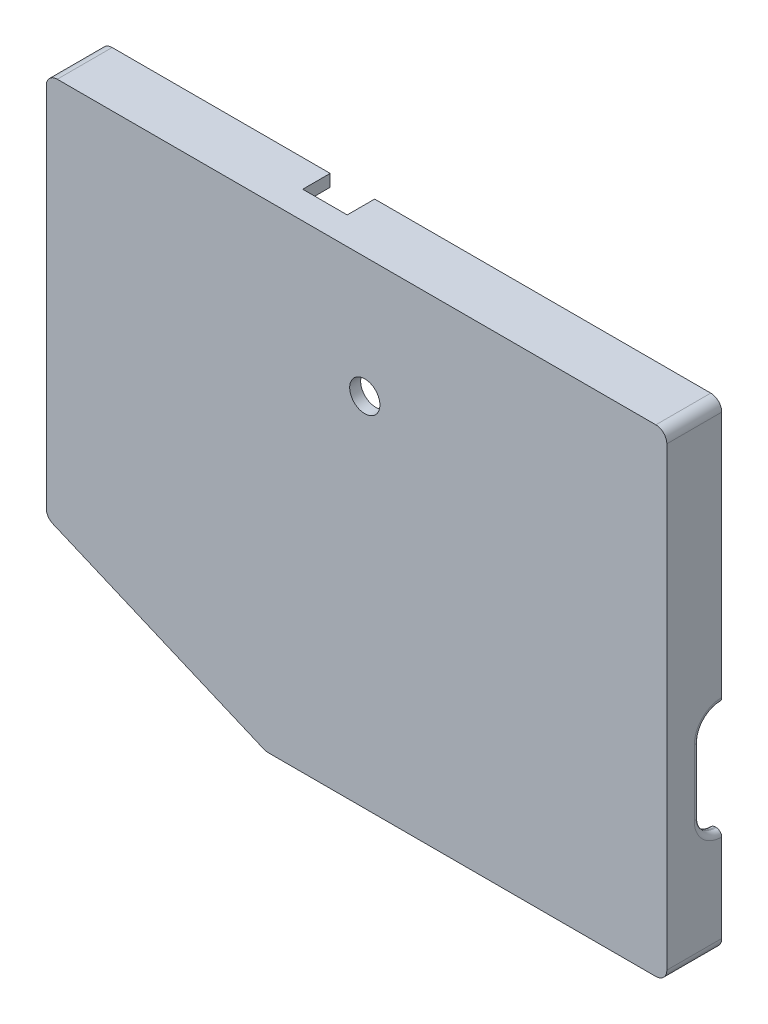
ISO-10303-21;
HEADER;
FILE_DESCRIPTION(('STEP AP214'),'2;1');
FILE_NAME('part.step','',(''),(''),'','','');
FILE_SCHEMA(('AUTOMOTIVE_DESIGN { 1 0 10303 214 1 1 1 1 }'));
ENDSEC;
DATA;
#1=APPLICATION_CONTEXT('core data for automotive mechanical design processes');
#2=APPLICATION_PROTOCOL_DEFINITION('international standard','automotive_design',2000,#1);
#3=PRODUCT_CONTEXT('',#1,'mechanical');
#4=PRODUCT('Part','Part','',(#3));
#5=PRODUCT_RELATED_PRODUCT_CATEGORY('part','',(#4));
#6=PRODUCT_DEFINITION_FORMATION('','',#4);
#7=PRODUCT_DEFINITION_CONTEXT('part definition',#1,'design');
#8=PRODUCT_DEFINITION('design','',#6,#7);
#9=PRODUCT_DEFINITION_SHAPE('','',#8);
#10=(LENGTH_UNIT() NAMED_UNIT(*) SI_UNIT(.MILLI.,.METRE.));
#11=(NAMED_UNIT(*) PLANE_ANGLE_UNIT() SI_UNIT($,.RADIAN.));
#12=(NAMED_UNIT(*) SI_UNIT($,.STERADIAN.) SOLID_ANGLE_UNIT());
#13=UNCERTAINTY_MEASURE_WITH_UNIT(LENGTH_MEASURE(1.E-05),#10,'distance_accuracy_value','');
#14=(GEOMETRIC_REPRESENTATION_CONTEXT(3) GLOBAL_UNCERTAINTY_ASSIGNED_CONTEXT((#13)) GLOBAL_UNIT_ASSIGNED_CONTEXT((#10,
#11,#12)) REPRESENTATION_CONTEXT('',''));
#15=CARTESIAN_POINT('',(0.,0.,0.));
#16=DIRECTION('',(0.,0.,1.));
#17=DIRECTION('',(1.,0.,0.));
#18=AXIS2_PLACEMENT_3D('',#15,#16,#17);
#19=CARTESIAN_POINT('',(16.5,43.5,0.));
#20=DIRECTION('',(0.,0.,1.));
#21=DIRECTION('',(1.,0.,0.));
#22=AXIS2_PLACEMENT_3D('',#19,#20,#21);
#23=PLANE('',#22);
#24=CARTESIAN_POINT('',(18.,65.,0.));
#25=DIRECTION('',(0.,0.,1.));
#26=DIRECTION('',(-1.,0.,0.));
#27=AXIS2_PLACEMENT_3D('',#24,#25,#26);
#28=CIRCLE('',#27,2.75);
#29=CARTESIAN_POINT('',(20.75,65.,0.));
#30=VERTEX_POINT('',#29);
#31=EDGE_CURVE('E330',#30,#30,#28,.T.);
#32=ORIENTED_EDGE('',*,*,#31,.T.);
#33=EDGE_LOOP('',(#32));
#34=FACE_BOUND('',#33,.T.);
#35=DIRECTION('',(0.,1.,0.));
#36=VECTOR('',#35,1.);
#37=CARTESIAN_POINT('',(-37.8,64.15,0.));
#38=LINE('',#37,#36);
#39=CARTESIAN_POINT('',(-37.8,18.4554445193311,0.));
#40=VERTEX_POINT('',#39);
#41=CARTESIAN_POINT('',(-37.8,84.8,0.));
#42=VERTEX_POINT('',#41);
#43=EDGE_CURVE('E312',#40,#42,#38,.T.);
#44=ORIENTED_EDGE('',*,*,#43,.T.);
#45=DIRECTION('',(1.,0.,0.));
#46=VECTOR('',#45,1.);
#47=CARTESIAN_POINT('',(43.65,84.8,0.));
#48=LINE('',#47,#46);
#49=CARTESIAN_POINT('',(70.8,84.8,0.));
#50=VERTEX_POINT('',#49);
#51=EDGE_CURVE('E411',#42,#50,#48,.T.);
#52=ORIENTED_EDGE('',*,*,#51,.T.);
#53=DIRECTION('',(0.,-1.,0.));
#54=VECTOR('',#53,1.);
#55=CARTESIAN_POINT('',(70.8,22.85,0.));
#56=LINE('',#55,#54);
#57=CARTESIAN_POINT('',(70.8,2.2,0.));
#58=VERTEX_POINT('',#57);
#59=EDGE_CURVE('E438',#50,#58,#56,.T.);
#60=ORIENTED_EDGE('',*,*,#59,.T.);
#61=DIRECTION('',(-1.,0.,0.));
#62=VECTOR('',#61,1.);
#63=CARTESIAN_POINT('',(8.47405237568362,2.2,0.));
#64=LINE('',#63,#62);
#65=CARTESIAN_POINT('',(0.448104751367242,2.2,0.));
#66=VERTEX_POINT('',#65);
#67=EDGE_CURVE('E311',#58,#66,#64,.T.);
#68=ORIENTED_EDGE('',*,*,#67,.T.);
#69=DIRECTION('',(-0.920330918458474,0.391140640344853,0.));
#70=VECTOR('',#69,1.);
#71=CARTESIAN_POINT('',(-19.3114604888446,10.5978152270901,0.));
#72=LINE('',#71,#70);
#73=EDGE_CURVE('E27',#66,#40,#72,.T.);
#74=ORIENTED_EDGE('',*,*,#73,.T.);
#75=EDGE_LOOP('',(#44,#52,#60,#68,#74));
#76=FACE_BOUND('',#75,.T.);
#77=ADVANCED_FACE('F16',(#34,#76),#23,.F.);
#78=CARTESIAN_POINT('',(16.5,43.5,2.));
#79=DIRECTION('',(0.,0.,1.));
#80=DIRECTION('',(1.,0.,0.));
#81=AXIS2_PLACEMENT_3D('',#78,#79,#80);
#82=PLANE('',#81);
#83=CARTESIAN_POINT('',(18.,65.,2.));
#84=DIRECTION('',(0.,0.,-1.));
#85=DIRECTION('',(-1.,0.,0.));
#86=AXIS2_PLACEMENT_3D('',#83,#84,#85);
#87=CIRCLE('',#86,2.75);
#88=CARTESIAN_POINT('',(20.75,65.,2.));
#89=VERTEX_POINT('',#88);
#90=EDGE_CURVE('E331',#89,#89,#87,.T.);
#91=ORIENTED_EDGE('',*,*,#90,.T.);
#92=EDGE_LOOP('',(#91));
#93=FACE_BOUND('',#92,.T.);
#94=CARTESIAN_POINT('',(-38.,18.3231313812102,2.));
#95=DIRECTION('',(0.,0.,-1.));
#96=DIRECTION('',(-0.834008585191079,-0.551751465632466,0.));
#97=AXIS2_PLACEMENT_3D('',#94,#95,#96);
#98=CIRCLE('',#97,2.);
#99=CARTESIAN_POINT('',(-38.7822812806898,16.4824695442932,2.));
#100=VERTEX_POINT('',#99);
#101=CARTESIAN_POINT('',(-40.,18.3231313812102,2.));
#102=VERTEX_POINT('',#101);
#103=EDGE_CURVE('E426',#100,#102,#98,.T.);
#104=ORIENTED_EDGE('',*,*,#103,.F.);
#105=DIRECTION('',(0.920330918458474,-0.391140640344853,0.));
#106=VECTOR('',#105,1.);
#107=CARTESIAN_POINT('',(-40.,17.,2.));
#108=LINE('',#107,#106);
#109=CARTESIAN_POINT('',(-0.374913324901298,0.159338163083051,2.));
#110=VERTEX_POINT('',#109);
#111=EDGE_CURVE('E361',#100,#110,#108,.T.);
#112=ORIENTED_EDGE('',*,*,#111,.T.);
#113=CARTESIAN_POINT('',(0.407367955788409,2.,2.));
#114=DIRECTION('',(0.,0.,-1.));
#115=DIRECTION('',(-0.199585923278078,-0.979880329034743,0.));
#116=AXIS2_PLACEMENT_3D('',#113,#114,#115);
#117=CIRCLE('',#116,2.);
#118=CARTESIAN_POINT('',(0.407367955788409,0.,2.));
#119=VERTEX_POINT('',#118);
#120=EDGE_CURVE('E376',#119,#110,#117,.T.);
#121=ORIENTED_EDGE('',*,*,#120,.F.);
#122=DIRECTION('',(1.,0.,0.));
#123=VECTOR('',#122,1.);
#124=CARTESIAN_POINT('',(0.,0.,2.));
#125=LINE('',#124,#123);
#126=CARTESIAN_POINT('',(71.,0.,2.));
#127=VERTEX_POINT('',#126);
#128=EDGE_CURVE('E404',#119,#127,#125,.T.);
#129=ORIENTED_EDGE('',*,*,#128,.T.);
#130=CARTESIAN_POINT('',(71.,2.,2.));
#131=DIRECTION('',(0.,0.,-1.));
#132=DIRECTION('',(0.707106781186549,-0.707106781186546,0.));
#133=AXIS2_PLACEMENT_3D('',#130,#131,#132);
#134=CIRCLE('',#133,2.);
#135=CARTESIAN_POINT('',(73.,2.,2.));
#136=VERTEX_POINT('',#135);
#137=EDGE_CURVE('E461',#136,#127,#134,.T.);
#138=ORIENTED_EDGE('',*,*,#137,.F.);
#139=DIRECTION('',(0.,1.,0.));
#140=VECTOR('',#139,1.);
#141=CARTESIAN_POINT('',(73.,0.,2.));
#142=LINE('',#141,#140);
#143=CARTESIAN_POINT('',(73.,85.,2.));
#144=VERTEX_POINT('',#143);
#145=EDGE_CURVE('E340',#136,#144,#142,.T.);
#146=ORIENTED_EDGE('',*,*,#145,.T.);
#147=CARTESIAN_POINT('',(71.,85.,2.));
#148=DIRECTION('',(0.,0.,-1.));
#149=DIRECTION('',(0.707106781186551,0.707106781186544,0.));
#150=AXIS2_PLACEMENT_3D('',#147,#148,#149);
#151=CIRCLE('',#150,2.);
#152=CARTESIAN_POINT('',(71.,87.,2.));
#153=VERTEX_POINT('',#152);
#154=EDGE_CURVE('E533',#153,#144,#151,.T.);
#155=ORIENTED_EDGE('',*,*,#154,.F.);
#156=DIRECTION('',(-1.,0.,0.));
#157=VECTOR('',#156,1.);
#158=CARTESIAN_POINT('',(73.,87.,2.));
#159=LINE('',#158,#157);
#160=CARTESIAN_POINT('',(-38.,87.,2.));
#161=VERTEX_POINT('',#160);
#162=EDGE_CURVE('E457',#153,#161,#159,.T.);
#163=ORIENTED_EDGE('',*,*,#162,.T.);
#164=CARTESIAN_POINT('',(-38.,85.,2.));
#165=DIRECTION('',(0.,0.,-1.));
#166=DIRECTION('',(-0.707106781186549,0.707106781186546,0.));
#167=AXIS2_PLACEMENT_3D('',#164,#165,#166);
#168=CIRCLE('',#167,2.);
#169=CARTESIAN_POINT('',(-40.,85.,2.));
#170=VERTEX_POINT('',#169);
#171=EDGE_CURVE('E399',#170,#161,#168,.T.);
#172=ORIENTED_EDGE('',*,*,#171,.F.);
#173=DIRECTION('',(0.,-1.,0.));
#174=VECTOR('',#173,1.);
#175=CARTESIAN_POINT('',(-40.,87.,2.));
#176=LINE('',#175,#174);
#177=EDGE_CURVE('E10',#170,#102,#176,.T.);
#178=ORIENTED_EDGE('',*,*,#177,.T.);
#179=EDGE_LOOP('',(#104,#112,#121,#129,#138,#146,#155,#163,#172,#178));
#180=FACE_BOUND('',#179,.T.);
#181=ADVANCED_FACE('F529',(#93,#180),#82,.T.);
#182=CARTESIAN_POINT('',(-40.,87.,0.));
#183=DIRECTION('',(-1.,0.,0.));
#184=DIRECTION('',(0.,0.,1.));
#185=AXIS2_PLACEMENT_3D('',#182,#183,#184);
#186=PLANE('',#185);
#187=DIRECTION('',(0.,0.,-1.));
#188=VECTOR('',#187,1.);
#189=CARTESIAN_POINT('',(-40.,18.3231313812102,0.));
#190=LINE('',#189,#188);
#191=CARTESIAN_POINT('',(-40.,18.3231313812102,-8.));
#192=VERTEX_POINT('',#191);
#193=EDGE_CURVE('E446',#102,#192,#190,.T.);
#194=ORIENTED_EDGE('',*,*,#193,.F.);
#195=ORIENTED_EDGE('',*,*,#177,.F.);
#196=DIRECTION('',(0.,0.,1.));
#197=VECTOR('',#196,1.);
#198=CARTESIAN_POINT('',(-40.,85.,0.));
#199=LINE('',#198,#197);
#200=CARTESIAN_POINT('',(-40.,85.,-8.));
#201=VERTEX_POINT('',#200);
#202=EDGE_CURVE('E398',#201,#170,#199,.T.);
#203=ORIENTED_EDGE('',*,*,#202,.F.);
#204=DIRECTION('',(0.,1.,0.));
#205=VECTOR('',#204,1.);
#206=CARTESIAN_POINT('',(-40.,87.,-8.));
#207=LINE('',#206,#205);
#208=EDGE_CURVE('E365',#192,#201,#207,.T.);
#209=ORIENTED_EDGE('',*,*,#208,.F.);
#210=EDGE_LOOP('',(#194,#195,#203,#209));
#211=FACE_BOUND('',#210,.T.);
#212=ADVANCED_FACE('F18',(#211),#186,.T.);
#213=CARTESIAN_POINT('',(-37.8,18.4554445193311,2.));
#214=DIRECTION('',(0.391140640344853,0.920330918458474,0.));
#215=DIRECTION('',(0.,0.,-1.));
#216=AXIS2_PLACEMENT_3D('',#213,#214,#215);
#217=PLANE('',#216);
#218=ORIENTED_EDGE('',*,*,#73,.F.);
#219=DIRECTION('',(0.,0.,-1.));
#220=VECTOR('',#219,1.);
#221=CARTESIAN_POINT('',(0.448104751367242,2.2,2.));
#222=LINE('',#221,#220);
#223=CARTESIAN_POINT('',(0.448104751367242,2.2,-8.));
#224=VERTEX_POINT('',#223);
#225=EDGE_CURVE('E344',#66,#224,#222,.T.);
#226=ORIENTED_EDGE('',*,*,#225,.T.);
#227=DIRECTION('',(0.920330918458474,-0.391140640344853,0.));
#228=VECTOR('',#227,1.);
#229=CARTESIAN_POINT('',(0.448104751367242,2.2,-8.));
#230=LINE('',#229,#228);
#231=CARTESIAN_POINT('',(-37.8,18.4554445193311,-8.));
#232=VERTEX_POINT('',#231);
#233=EDGE_CURVE('E287',#232,#224,#230,.T.);
#234=ORIENTED_EDGE('',*,*,#233,.F.);
#235=DIRECTION('',(0.,0.,-1.));
#236=VECTOR('',#235,1.);
#237=CARTESIAN_POINT('',(-37.8,18.4554445193311,2.));
#238=LINE('',#237,#236);
#239=EDGE_CURVE('E307',#40,#232,#238,.T.);
#240=ORIENTED_EDGE('',*,*,#239,.F.);
#241=EDGE_LOOP('',(#218,#226,#234,#240));
#242=FACE_BOUND('',#241,.T.);
#243=ADVANCED_FACE('F554',(#242),#217,.T.);
#244=CARTESIAN_POINT('',(0.448104751367246,2.2,2.));
#245=DIRECTION('',(0.,1.,0.));
#246=DIRECTION('',(1.,0.,0.));
#247=AXIS2_PLACEMENT_3D('',#244,#245,#246);
#248=PLANE('',#247);
#249=ORIENTED_EDGE('',*,*,#67,.F.);
#250=DIRECTION('',(0.,0.,-1.));
#251=VECTOR('',#250,1.);
#252=CARTESIAN_POINT('',(70.8,2.2,2.));
#253=LINE('',#252,#251);
#254=CARTESIAN_POINT('',(70.8,2.2,-8.));
#255=VERTEX_POINT('',#254);
#256=EDGE_CURVE('E571',#58,#255,#253,.T.);
#257=ORIENTED_EDGE('',*,*,#256,.T.);
#258=DIRECTION('',(1.,0.,0.));
#259=VECTOR('',#258,1.);
#260=CARTESIAN_POINT('',(70.8,2.2,-8.));
#261=LINE('',#260,#259);
#262=EDGE_CURVE('E280',#224,#255,#261,.T.);
#263=ORIENTED_EDGE('',*,*,#262,.F.);
#264=ORIENTED_EDGE('',*,*,#225,.F.);
#265=EDGE_LOOP('',(#249,#257,#263,#264));
#266=FACE_BOUND('',#265,.T.);
#267=ADVANCED_FACE('F921',(#266),#248,.T.);
#268=CARTESIAN_POINT('',(-37.8,84.8,2.));
#269=DIRECTION('',(1.,0.,0.));
#270=DIRECTION('',(0.,1.,0.));
#271=AXIS2_PLACEMENT_3D('',#268,#269,#270);
#272=PLANE('',#271);
#273=ORIENTED_EDGE('',*,*,#43,.F.);
#274=ORIENTED_EDGE('',*,*,#239,.T.);
#275=DIRECTION('',(0.,-1.,0.));
#276=VECTOR('',#275,1.);
#277=CARTESIAN_POINT('',(-37.8,18.4554445193311,-8.));
#278=LINE('',#277,#276);
#279=CARTESIAN_POINT('',(-37.8,84.8,-8.));
#280=VERTEX_POINT('',#279);
#281=EDGE_CURVE('E394',#280,#232,#278,.T.);
#282=ORIENTED_EDGE('',*,*,#281,.F.);
#283=DIRECTION('',(0.,0.,-1.));
#284=VECTOR('',#283,1.);
#285=CARTESIAN_POINT('',(-37.8,84.8,2.));
#286=LINE('',#285,#284);
#287=EDGE_CURVE('E415',#42,#280,#286,.T.);
#288=ORIENTED_EDGE('',*,*,#287,.F.);
#289=EDGE_LOOP('',(#273,#274,#282,#288));
#290=FACE_BOUND('',#289,.T.);
#291=ADVANCED_FACE('F552',(#290),#272,.T.);
#292=CARTESIAN_POINT('',(70.8,2.2,2.));
#293=DIRECTION('',(-1.,0.,0.));
#294=DIRECTION('',(0.,0.,1.));
#295=AXIS2_PLACEMENT_3D('',#292,#293,#294);
#296=PLANE('',#295);
#297=CARTESIAN_POINT('',(70.8,23.,-8.));
#298=DIRECTION('',(-1.,0.,0.));
#299=DIRECTION('',(0.,-0.707106781186548,0.707106781186548));
#300=AXIS2_PLACEMENT_3D('',#297,#298,#299);
#301=CIRCLE('',#300,5.);
#302=CARTESIAN_POINT('',(70.8,18.,-8.));
#303=VERTEX_POINT('',#302);
#304=CARTESIAN_POINT('',(70.8,23.,-3.));
#305=VERTEX_POINT('',#304);
#306=EDGE_CURVE('E250',#303,#305,#301,.T.);
#307=ORIENTED_EDGE('',*,*,#306,.F.);
#308=DIRECTION('',(0.,1.,0.));
#309=VECTOR('',#308,1.);
#310=CARTESIAN_POINT('',(70.8,84.8,-8.));
#311=LINE('',#310,#309);
#312=EDGE_CURVE('E255',#255,#303,#311,.T.);
#313=ORIENTED_EDGE('',*,*,#312,.F.);
#314=ORIENTED_EDGE('',*,*,#256,.F.);
#315=ORIENTED_EDGE('',*,*,#59,.F.);
#316=DIRECTION('',(0.,0.,-1.));
#317=VECTOR('',#316,1.);
#318=CARTESIAN_POINT('',(70.8,84.8,2.));
#319=LINE('',#318,#317);
#320=CARTESIAN_POINT('',(70.8,84.8,-8.));
#321=VERTEX_POINT('',#320);
#322=EDGE_CURVE('E384',#50,#321,#319,.T.);
#323=ORIENTED_EDGE('',*,*,#322,.T.);
#324=DIRECTION('',(0.,1.,0.));
#325=VECTOR('',#324,1.);
#326=CARTESIAN_POINT('',(70.8,84.8,-8.));
#327=LINE('',#326,#325);
#328=CARTESIAN_POINT('',(70.8,40.,-8.));
#329=VERTEX_POINT('',#328);
#330=EDGE_CURVE('E416',#329,#321,#327,.T.);
#331=ORIENTED_EDGE('',*,*,#330,.F.);
#332=CARTESIAN_POINT('',(70.8,35.,-8.));
#333=DIRECTION('',(-1.,0.,0.));
#334=DIRECTION('',(0.,0.707106781186547,0.707106781186548));
#335=AXIS2_PLACEMENT_3D('',#332,#333,#334);
#336=CIRCLE('',#335,5.);
#337=CARTESIAN_POINT('',(70.8,35.,-3.));
#338=VERTEX_POINT('',#337);
#339=EDGE_CURVE('E375',#338,#329,#336,.T.);
#340=ORIENTED_EDGE('',*,*,#339,.F.);
#341=DIRECTION('',(0.,1.,0.));
#342=VECTOR('',#341,1.);
#343=CARTESIAN_POINT('',(70.8,12.6,-3.));
#344=LINE('',#343,#342);
#345=EDGE_CURVE('E258',#305,#338,#344,.T.);
#346=ORIENTED_EDGE('',*,*,#345,.F.);
#347=EDGE_LOOP('',(#307,#313,#314,#315,#323,#331,#340,#346));
#348=FACE_BOUND('',#347,.T.);
#349=ADVANCED_FACE('F252',(#348),#296,.T.);
#350=CARTESIAN_POINT('',(18.,65.,2.));
#351=DIRECTION('',(0.,0.,-1.));
#352=DIRECTION('',(-1.,0.,0.));
#353=AXIS2_PLACEMENT_3D('',#350,#351,#352);
#354=CYLINDRICAL_SURFACE('',#353,2.75);
#355=ORIENTED_EDGE('',*,*,#90,.F.);
#356=DIRECTION('',(0.,0.,-1.));
#357=VECTOR('',#356,1.);
#358=CARTESIAN_POINT('',(20.75,65.,2.));
#359=LINE('',#358,#357);
#360=EDGE_CURVE('E326',#89,#30,#359,.T.);
#361=ORIENTED_EDGE('',*,*,#360,.T.);
#362=ORIENTED_EDGE('',*,*,#31,.F.);
#363=ORIENTED_EDGE('',*,*,#360,.F.);
#364=EDGE_LOOP('',(#355,#361,#362,#363));
#365=FACE_BOUND('',#364,.T.);
#366=ADVANCED_FACE('F946',(#365),#354,.F.);
#367=CARTESIAN_POINT('',(70.8,84.8,2.));
#368=DIRECTION('',(0.,-1.,0.));
#369=DIRECTION('',(0.,0.,-1.));
#370=AXIS2_PLACEMENT_3D('',#367,#368,#369);
#371=PLANE('',#370);
#372=DIRECTION('',(0.,0.,1.));
#373=VECTOR('',#372,1.);
#374=CARTESIAN_POINT('',(1.7,84.8,-3.));
#375=LINE('',#374,#373);
#376=CARTESIAN_POINT('',(1.7,84.8,-8.));
#377=VERTEX_POINT('',#376);
#378=CARTESIAN_POINT('',(1.7,84.8,-3.));
#379=VERTEX_POINT('',#378);
#380=EDGE_CURVE('E335',#377,#379,#375,.T.);
#381=ORIENTED_EDGE('',*,*,#380,.T.);
#382=DIRECTION('',(1.,0.,0.));
#383=VECTOR('',#382,1.);
#384=CARTESIAN_POINT('',(36.25,84.8,-3.));
#385=LINE('',#384,#383);
#386=CARTESIAN_POINT('',(9.8,84.8,-3.));
#387=VERTEX_POINT('',#386);
#388=EDGE_CURVE('E336',#379,#387,#385,.T.);
#389=ORIENTED_EDGE('',*,*,#388,.T.);
#390=DIRECTION('',(0.,0.,-1.));
#391=VECTOR('',#390,1.);
#392=CARTESIAN_POINT('',(9.8,84.8,-0.5));
#393=LINE('',#392,#391);
#394=CARTESIAN_POINT('',(9.8,84.8,-8.));
#395=VERTEX_POINT('',#394);
#396=EDGE_CURVE('E381',#387,#395,#393,.T.);
#397=ORIENTED_EDGE('',*,*,#396,.T.);
#398=DIRECTION('',(-1.,0.,0.));
#399=VECTOR('',#398,1.);
#400=CARTESIAN_POINT('',(-37.8,84.8,-8.));
#401=LINE('',#400,#399);
#402=EDGE_CURVE('E420',#321,#395,#401,.T.);
#403=ORIENTED_EDGE('',*,*,#402,.F.);
#404=ORIENTED_EDGE('',*,*,#322,.F.);
#405=ORIENTED_EDGE('',*,*,#51,.F.);
#406=ORIENTED_EDGE('',*,*,#287,.T.);
#407=DIRECTION('',(-1.,0.,0.));
#408=VECTOR('',#407,1.);
#409=CARTESIAN_POINT('',(-37.8,84.8,-8.));
#410=LINE('',#409,#408);
#411=EDGE_CURVE('E371',#377,#280,#410,.T.);
#412=ORIENTED_EDGE('',*,*,#411,.F.);
#413=EDGE_LOOP('',(#381,#389,#397,#403,#404,#405,#406,#412));
#414=FACE_BOUND('',#413,.T.);
#415=ADVANCED_FACE('F558',(#414),#371,.T.);
#416=CARTESIAN_POINT('',(9.8,84.8,-3.));
#417=DIRECTION('',(1.,0.,0.));
#418=DIRECTION('',(0.,1.,0.));
#419=AXIS2_PLACEMENT_3D('',#416,#417,#418);
#420=PLANE('',#419);
#421=DIRECTION('',(0.,0.,1.));
#422=VECTOR('',#421,1.);
#423=CARTESIAN_POINT('',(9.8,87.,-1.5));
#424=LINE('',#423,#422);
#425=CARTESIAN_POINT('',(9.8,87.,-8.));
#426=VERTEX_POINT('',#425);
#427=CARTESIAN_POINT('',(9.8,87.,-3.));
#428=VERTEX_POINT('',#427);
#429=EDGE_CURVE('E317',#426,#428,#424,.T.);
#430=ORIENTED_EDGE('',*,*,#429,.F.);
#431=DIRECTION('',(0.,1.,0.));
#432=VECTOR('',#431,1.);
#433=CARTESIAN_POINT('',(9.8,64.15,-8.));
#434=LINE('',#433,#432);
#435=EDGE_CURVE('E466',#395,#426,#434,.T.);
#436=ORIENTED_EDGE('',*,*,#435,.F.);
#437=ORIENTED_EDGE('',*,*,#396,.F.);
#438=DIRECTION('',(0.,1.,0.));
#439=VECTOR('',#438,1.);
#440=CARTESIAN_POINT('',(9.8,84.8,-3.));
#441=LINE('',#440,#439);
#442=EDGE_CURVE('E337',#387,#428,#441,.T.);
#443=ORIENTED_EDGE('',*,*,#442,.T.);
#444=EDGE_LOOP('',(#430,#436,#437,#443));
#445=FACE_BOUND('',#444,.T.);
#446=ADVANCED_FACE('F1011',(#445),#420,.F.);
#447=CARTESIAN_POINT('',(1.7,84.8,-8.));
#448=DIRECTION('',(-1.,0.,0.));
#449=DIRECTION('',(0.,0.,1.));
#450=AXIS2_PLACEMENT_3D('',#447,#448,#449);
#451=PLANE('',#450);
#452=DIRECTION('',(0.,0.,-1.));
#453=VECTOR('',#452,1.);
#454=CARTESIAN_POINT('',(1.70000000000003,87.,-4.));
#455=LINE('',#454,#453);
#456=CARTESIAN_POINT('',(1.7,87.,-3.));
#457=VERTEX_POINT('',#456);
#458=CARTESIAN_POINT('',(1.7,87.,-8.));
#459=VERTEX_POINT('',#458);
#460=EDGE_CURVE('E515',#457,#459,#455,.T.);
#461=ORIENTED_EDGE('',*,*,#460,.F.);
#462=DIRECTION('',(0.,1.,0.));
#463=VECTOR('',#462,1.);
#464=CARTESIAN_POINT('',(1.7,84.8,-3.));
#465=LINE('',#464,#463);
#466=EDGE_CURVE('E332',#379,#457,#465,.T.);
#467=ORIENTED_EDGE('',*,*,#466,.F.);
#468=ORIENTED_EDGE('',*,*,#380,.F.);
#469=DIRECTION('',(0.,-1.,0.));
#470=VECTOR('',#469,1.);
#471=CARTESIAN_POINT('',(1.7,64.15,-8.));
#472=LINE('',#471,#470);
#473=EDGE_CURVE('E367',#459,#377,#472,.T.);
#474=ORIENTED_EDGE('',*,*,#473,.F.);
#475=EDGE_LOOP('',(#461,#467,#468,#474));
#476=FACE_BOUND('',#475,.T.);
#477=ADVANCED_FACE('F1000',(#476),#451,.F.);
#478=CARTESIAN_POINT('',(1.7,84.8,-3.));
#479=DIRECTION('',(0.,0.,1.));
#480=DIRECTION('',(1.,0.,0.));
#481=AXIS2_PLACEMENT_3D('',#478,#479,#480);
#482=PLANE('',#481);
#483=DIRECTION('',(-1.,0.,0.));
#484=VECTOR('',#483,1.);
#485=CARTESIAN_POINT('',(37.35,87.,-3.));
#486=LINE('',#485,#484);
#487=EDGE_CURVE('E453',#428,#457,#486,.T.);
#488=ORIENTED_EDGE('',*,*,#487,.F.);
#489=ORIENTED_EDGE('',*,*,#442,.F.);
#490=ORIENTED_EDGE('',*,*,#388,.F.);
#491=ORIENTED_EDGE('',*,*,#466,.T.);
#492=EDGE_LOOP('',(#488,#489,#490,#491));
#493=FACE_BOUND('',#492,.T.);
#494=ADVANCED_FACE('F969',(#493),#482,.F.);
#495=CARTESIAN_POINT('',(73.,0.,0.));
#496=DIRECTION('',(1.,0.,0.));
#497=DIRECTION('',(0.,-1.,0.));
#498=AXIS2_PLACEMENT_3D('',#495,#496,#497);
#499=PLANE('',#498);
#500=DIRECTION('',(0.,0.,-1.));
#501=VECTOR('',#500,1.);
#502=CARTESIAN_POINT('',(73.,85.,0.));
#503=LINE('',#502,#501);
#504=CARTESIAN_POINT('',(73.,85.,-8.));
#505=VERTEX_POINT('',#504);
#506=EDGE_CURVE('E581',#144,#505,#503,.T.);
#507=ORIENTED_EDGE('',*,*,#506,.F.);
#508=ORIENTED_EDGE('',*,*,#145,.F.);
#509=DIRECTION('',(0.,0.,1.));
#510=VECTOR('',#509,1.);
#511=CARTESIAN_POINT('',(73.,2.,0.));
#512=LINE('',#511,#510);
#513=CARTESIAN_POINT('',(73.,2.,-8.));
#514=VERTEX_POINT('',#513);
#515=EDGE_CURVE('E407',#514,#136,#512,.T.);
#516=ORIENTED_EDGE('',*,*,#515,.F.);
#517=DIRECTION('',(0.,-1.,0.));
#518=VECTOR('',#517,1.);
#519=CARTESIAN_POINT('',(73.,0.,-8.));
#520=LINE('',#519,#518);
#521=CARTESIAN_POINT('',(73.,18.,-8.));
#522=VERTEX_POINT('',#521);
#523=EDGE_CURVE('E474',#522,#514,#520,.T.);
#524=ORIENTED_EDGE('',*,*,#523,.F.);
#525=CARTESIAN_POINT('',(73.,23.,-8.));
#526=DIRECTION('',(1.,0.,0.));
#527=DIRECTION('',(0.,-0.707106781186548,0.707106781186548));
#528=AXIS2_PLACEMENT_3D('',#525,#526,#527);
#529=CIRCLE('',#528,5.);
#530=CARTESIAN_POINT('',(73.,23.,-3.));
#531=VERTEX_POINT('',#530);
#532=EDGE_CURVE('E302',#531,#522,#529,.T.);
#533=ORIENTED_EDGE('',*,*,#532,.F.);
#534=DIRECTION('',(0.,-1.,0.));
#535=VECTOR('',#534,1.);
#536=CARTESIAN_POINT('',(73.,11.5,-3.));
#537=LINE('',#536,#535);
#538=CARTESIAN_POINT('',(73.,35.,-3.));
#539=VERTEX_POINT('',#538);
#540=EDGE_CURVE('E343',#539,#531,#537,.T.);
#541=ORIENTED_EDGE('',*,*,#540,.F.);
#542=CARTESIAN_POINT('',(73.,35.,-8.));
#543=DIRECTION('',(1.,0.,0.));
#544=DIRECTION('',(0.,0.707106781186547,0.707106781186548));
#545=AXIS2_PLACEMENT_3D('',#542,#543,#544);
#546=CIRCLE('',#545,5.);
#547=CARTESIAN_POINT('',(73.,40.,-8.));
#548=VERTEX_POINT('',#547);
#549=EDGE_CURVE('E20',#548,#539,#546,.T.);
#550=ORIENTED_EDGE('',*,*,#549,.F.);
#551=DIRECTION('',(0.,-1.,0.));
#552=VECTOR('',#551,1.);
#553=CARTESIAN_POINT('',(73.,0.,-8.));
#554=LINE('',#553,#552);
#555=EDGE_CURVE('E293',#505,#548,#554,.T.);
#556=ORIENTED_EDGE('',*,*,#555,.F.);
#557=EDGE_LOOP('',(#507,#508,#516,#524,#533,#541,#550,#556));
#558=FACE_BOUND('',#557,.T.);
#559=ADVANCED_FACE('F964',(#558),#499,.T.);
#560=CARTESIAN_POINT('',(72.,35.,-8.));
#561=DIRECTION('',(-1.,0.,0.));
#562=DIRECTION('',(0.,0.,1.));
#563=AXIS2_PLACEMENT_3D('',#560,#561,#562);
#564=TOROIDAL_SURFACE('',#563,5.,1.);
#565=CARTESIAN_POINT('',(72.,40.,-8.));
#566=DIRECTION('',(0.,0.,1.));
#567=DIRECTION('',(0.,1.,0.));
#568=AXIS2_PLACEMENT_3D('',#565,#566,#567);
#569=CIRCLE('',#568,1.);
#570=CARTESIAN_POINT('',(72.,39.,-8.));
#571=VERTEX_POINT('',#570);
#572=EDGE_CURVE('E297',#571,#548,#569,.T.);
#573=ORIENTED_EDGE('',*,*,#572,.T.);
#574=ORIENTED_EDGE('',*,*,#549,.T.);
#575=CARTESIAN_POINT('',(72.,35.,-3.));
#576=DIRECTION('',(0.,-1.,0.));
#577=DIRECTION('',(0.,0.,-1.));
#578=AXIS2_PLACEMENT_3D('',#575,#576,#577);
#579=CIRCLE('',#578,1.);
#580=CARTESIAN_POINT('',(72.,35.,-4.));
#581=VERTEX_POINT('',#580);
#582=EDGE_CURVE('E305',#581,#539,#579,.T.);
#583=ORIENTED_EDGE('',*,*,#582,.F.);
#584=CARTESIAN_POINT('',(72.,35.,-8.));
#585=DIRECTION('',(-1.,0.,0.));
#586=DIRECTION('',(0.,0.707106781186547,0.707106781186548));
#587=AXIS2_PLACEMENT_3D('',#584,#585,#586);
#588=CIRCLE('',#587,4.);
#589=EDGE_CURVE('E498',#581,#571,#588,.T.);
#590=ORIENTED_EDGE('',*,*,#589,.T.);
#591=EDGE_LOOP('',(#573,#574,#583,#590));
#592=FACE_BOUND('',#591,.T.);
#593=ADVANCED_FACE('F934',(#592),#564,.T.);
#594=CARTESIAN_POINT('',(72.,11.5,-3.));
#595=DIRECTION('',(0.,1.,0.));
#596=DIRECTION('',(0.707106781186546,0.,-0.707106781186549));
#597=AXIS2_PLACEMENT_3D('',#594,#595,#596);
#598=CYLINDRICAL_SURFACE('',#597,1.);
#599=ORIENTED_EDGE('',*,*,#582,.T.);
#600=ORIENTED_EDGE('',*,*,#540,.T.);
#601=CARTESIAN_POINT('',(72.,23.,-3.));
#602=DIRECTION('',(0.,-1.,0.));
#603=DIRECTION('',(0.,0.,-1.));
#604=AXIS2_PLACEMENT_3D('',#601,#602,#603);
#605=CIRCLE('',#604,1.);
#606=CARTESIAN_POINT('',(72.,23.,-4.));
#607=VERTEX_POINT('',#606);
#608=EDGE_CURVE('E306',#607,#531,#605,.T.);
#609=ORIENTED_EDGE('',*,*,#608,.F.);
#610=DIRECTION('',(0.,1.,0.));
#611=VECTOR('',#610,1.);
#612=CARTESIAN_POINT('',(72.,11.5,-4.));
#613=LINE('',#612,#611);
#614=EDGE_CURVE('E291',#607,#581,#613,.T.);
#615=ORIENTED_EDGE('',*,*,#614,.T.);
#616=EDGE_LOOP('',(#599,#600,#609,#615));
#617=FACE_BOUND('',#616,.T.);
#618=ADVANCED_FACE('F929',(#617),#598,.T.);
#619=CARTESIAN_POINT('',(72.,23.,-8.));
#620=DIRECTION('',(-1.,0.,0.));
#621=DIRECTION('',(0.,0.,1.));
#622=AXIS2_PLACEMENT_3D('',#619,#620,#621);
#623=TOROIDAL_SURFACE('',#622,5.,1.);
#624=CARTESIAN_POINT('',(72.,18.,-8.));
#625=DIRECTION('',(0.,0.,1.));
#626=DIRECTION('',(0.,-1.,0.));
#627=AXIS2_PLACEMENT_3D('',#624,#625,#626);
#628=CIRCLE('',#627,1.);
#629=CARTESIAN_POINT('',(72.,19.,-8.));
#630=VERTEX_POINT('',#629);
#631=EDGE_CURVE('E470',#522,#630,#628,.T.);
#632=ORIENTED_EDGE('',*,*,#631,.T.);
#633=CARTESIAN_POINT('',(72.,23.,-8.));
#634=DIRECTION('',(-1.,0.,0.));
#635=DIRECTION('',(0.,-0.707106781186548,0.707106781186548));
#636=AXIS2_PLACEMENT_3D('',#633,#634,#635);
#637=CIRCLE('',#636,4.);
#638=EDGE_CURVE('E325',#630,#607,#637,.T.);
#639=ORIENTED_EDGE('',*,*,#638,.T.);
#640=ORIENTED_EDGE('',*,*,#608,.T.);
#641=ORIENTED_EDGE('',*,*,#532,.T.);
#642=EDGE_LOOP('',(#632,#639,#640,#641));
#643=FACE_BOUND('',#642,.T.);
#644=ADVANCED_FACE('F625',(#643),#623,.T.);
#645=CARTESIAN_POINT('',(73.,35.,-8.));
#646=DIRECTION('',(-1.,0.,0.));
#647=DIRECTION('',(0.,0.,-1.));
#648=AXIS2_PLACEMENT_3D('',#645,#646,#647);
#649=CYLINDRICAL_SURFACE('',#648,4.);
#650=CARTESIAN_POINT('',(71.8,35.,-8.));
#651=DIRECTION('',(1.,0.,0.));
#652=DIRECTION('',(0.,0.707106781186547,0.707106781186548));
#653=AXIS2_PLACEMENT_3D('',#650,#651,#652);
#654=CIRCLE('',#653,4.);
#655=CARTESIAN_POINT('',(71.8,39.,-8.));
#656=VERTEX_POINT('',#655);
#657=CARTESIAN_POINT('',(71.8,35.,-4.));
#658=VERTEX_POINT('',#657);
#659=EDGE_CURVE('E379',#656,#658,#654,.T.);
#660=ORIENTED_EDGE('',*,*,#659,.F.);
#661=DIRECTION('',(-1.,0.,0.));
#662=VECTOR('',#661,1.);
#663=CARTESIAN_POINT('',(73.,39.,-8.));
#664=LINE('',#663,#662);
#665=EDGE_CURVE('E435',#571,#656,#664,.T.);
#666=ORIENTED_EDGE('',*,*,#665,.F.);
#667=ORIENTED_EDGE('',*,*,#589,.F.);
#668=DIRECTION('',(-1.,0.,0.));
#669=VECTOR('',#668,1.);
#670=CARTESIAN_POINT('',(73.,35.,-4.));
#671=LINE('',#670,#669);
#672=EDGE_CURVE('E614',#581,#658,#671,.T.);
#673=ORIENTED_EDGE('',*,*,#672,.T.);
#674=EDGE_LOOP('',(#660,#666,#667,#673));
#675=FACE_BOUND('',#674,.T.);
#676=ADVANCED_FACE('F1018',(#675),#649,.F.);
#677=CARTESIAN_POINT('',(73.,23.,-4.));
#678=DIRECTION('',(0.,0.,1.));
#679=DIRECTION('',(0.,-1.,0.));
#680=AXIS2_PLACEMENT_3D('',#677,#678,#679);
#681=PLANE('',#680);
#682=DIRECTION('',(0.,-1.,0.));
#683=VECTOR('',#682,1.);
#684=CARTESIAN_POINT('',(71.8,12.6,-4.));
#685=LINE('',#684,#683);
#686=CARTESIAN_POINT('',(71.8,23.,-4.));
#687=VERTEX_POINT('',#686);
#688=EDGE_CURVE('E264',#658,#687,#685,.T.);
#689=ORIENTED_EDGE('',*,*,#688,.F.);
#690=ORIENTED_EDGE('',*,*,#672,.F.);
#691=ORIENTED_EDGE('',*,*,#614,.F.);
#692=DIRECTION('',(-1.,0.,0.));
#693=VECTOR('',#692,1.);
#694=CARTESIAN_POINT('',(73.,23.,-4.));
#695=LINE('',#694,#693);
#696=EDGE_CURVE('E322',#607,#687,#695,.T.);
#697=ORIENTED_EDGE('',*,*,#696,.T.);
#698=EDGE_LOOP('',(#689,#690,#691,#697));
#699=FACE_BOUND('',#698,.T.);
#700=ADVANCED_FACE('F632',(#699),#681,.F.);
#701=CARTESIAN_POINT('',(73.,23.,-8.));
#702=DIRECTION('',(-1.,0.,0.));
#703=DIRECTION('',(0.,0.,1.));
#704=AXIS2_PLACEMENT_3D('',#701,#702,#703);
#705=CYLINDRICAL_SURFACE('',#704,4.);
#706=CARTESIAN_POINT('',(71.8,23.,-8.));
#707=DIRECTION('',(1.,0.,0.));
#708=DIRECTION('',(0.,-0.707106781186548,0.707106781186548));
#709=AXIS2_PLACEMENT_3D('',#706,#707,#708);
#710=CIRCLE('',#709,4.);
#711=CARTESIAN_POINT('',(71.8,19.,-8.));
#712=VERTEX_POINT('',#711);
#713=EDGE_CURVE('E263',#687,#712,#710,.T.);
#714=ORIENTED_EDGE('',*,*,#713,.F.);
#715=ORIENTED_EDGE('',*,*,#696,.F.);
#716=ORIENTED_EDGE('',*,*,#638,.F.);
#717=DIRECTION('',(1.,0.,0.));
#718=VECTOR('',#717,1.);
#719=CARTESIAN_POINT('',(73.,19.,-8.));
#720=LINE('',#719,#718);
#721=EDGE_CURVE('E274',#712,#630,#720,.T.);
#722=ORIENTED_EDGE('',*,*,#721,.F.);
#723=EDGE_LOOP('',(#714,#715,#716,#722));
#724=FACE_BOUND('',#723,.T.);
#725=ADVANCED_FACE('F628',(#724),#705,.F.);
#726=CARTESIAN_POINT('',(71.8,23.,-8.));
#727=DIRECTION('',(1.,0.,0.));
#728=DIRECTION('',(0.,0.,-1.));
#729=AXIS2_PLACEMENT_3D('',#726,#727,#728);
#730=TOROIDAL_SURFACE('',#729,5.,1.);
#731=CARTESIAN_POINT('',(71.8,18.,-8.));
#732=DIRECTION('',(0.,0.,1.));
#733=DIRECTION('',(0.,-1.,0.));
#734=AXIS2_PLACEMENT_3D('',#731,#732,#733);
#735=CIRCLE('',#734,1.);
#736=EDGE_CURVE('E267',#712,#303,#735,.T.);
#737=ORIENTED_EDGE('',*,*,#736,.T.);
#738=ORIENTED_EDGE('',*,*,#306,.T.);
#739=CARTESIAN_POINT('',(71.8,23.,-3.));
#740=DIRECTION('',(0.,1.,0.));
#741=DIRECTION('',(0.,0.,-1.));
#742=AXIS2_PLACEMENT_3D('',#739,#740,#741);
#743=CIRCLE('',#742,1.);
#744=EDGE_CURVE('E300',#687,#305,#743,.T.);
#745=ORIENTED_EDGE('',*,*,#744,.F.);
#746=ORIENTED_EDGE('',*,*,#713,.T.);
#747=EDGE_LOOP('',(#737,#738,#745,#746));
#748=FACE_BOUND('',#747,.T.);
#749=ADVANCED_FACE('F268',(#748),#730,.T.);
#750=CARTESIAN_POINT('',(71.8,12.6,-3.));
#751=DIRECTION('',(0.,-1.,0.));
#752=DIRECTION('',(-0.70710678118654,0.,-0.707106781186555));
#753=AXIS2_PLACEMENT_3D('',#750,#751,#752);
#754=CYLINDRICAL_SURFACE('',#753,1.);
#755=ORIENTED_EDGE('',*,*,#744,.T.);
#756=ORIENTED_EDGE('',*,*,#345,.T.);
#757=CARTESIAN_POINT('',(71.8,35.,-3.));
#758=DIRECTION('',(0.,1.,0.));
#759=DIRECTION('',(0.,0.,-1.));
#760=AXIS2_PLACEMENT_3D('',#757,#758,#759);
#761=CIRCLE('',#760,1.);
#762=EDGE_CURVE('E402',#658,#338,#761,.T.);
#763=ORIENTED_EDGE('',*,*,#762,.F.);
#764=ORIENTED_EDGE('',*,*,#688,.T.);
#765=EDGE_LOOP('',(#755,#756,#763,#764));
#766=FACE_BOUND('',#765,.T.);
#767=ADVANCED_FACE('F893',(#766),#754,.T.);
#768=CARTESIAN_POINT('',(71.8,35.,-8.));
#769=DIRECTION('',(1.,0.,0.));
#770=DIRECTION('',(0.,0.,-1.));
#771=AXIS2_PLACEMENT_3D('',#768,#769,#770);
#772=TOROIDAL_SURFACE('',#771,5.,1.);
#773=CARTESIAN_POINT('',(71.8,40.,-8.));
#774=DIRECTION('',(0.,0.,1.));
#775=DIRECTION('',(0.,1.,0.));
#776=AXIS2_PLACEMENT_3D('',#773,#774,#775);
#777=CIRCLE('',#776,1.);
#778=EDGE_CURVE('E421',#329,#656,#777,.T.);
#779=ORIENTED_EDGE('',*,*,#778,.T.);
#780=ORIENTED_EDGE('',*,*,#659,.T.);
#781=ORIENTED_EDGE('',*,*,#762,.T.);
#782=ORIENTED_EDGE('',*,*,#339,.T.);
#783=EDGE_LOOP('',(#779,#780,#781,#782));
#784=FACE_BOUND('',#783,.T.);
#785=ADVANCED_FACE('F886',(#784),#772,.T.);
#786=CARTESIAN_POINT('',(0.407367955788409,2.,0.));
#787=DIRECTION('',(0.,0.,1.));
#788=DIRECTION('',(-0.199585923278078,-0.979880329034743,0.));
#789=AXIS2_PLACEMENT_3D('',#786,#787,#788);
#790=CYLINDRICAL_SURFACE('',#789,2.);
#791=ORIENTED_EDGE('',*,*,#120,.T.);
#792=DIRECTION('',(0.,0.,-1.));
#793=VECTOR('',#792,1.);
#794=CARTESIAN_POINT('',(-0.374913324901298,0.159338163083049,0.));
#795=LINE('',#794,#793);
#796=CARTESIAN_POINT('',(-0.374913324901298,0.159338163083051,-8.));
#797=VERTEX_POINT('',#796);
#798=EDGE_CURVE('E366',#110,#797,#795,.T.);
#799=ORIENTED_EDGE('',*,*,#798,.T.);
#800=CARTESIAN_POINT('',(0.407367955788409,2.,-8.));
#801=DIRECTION('',(0.,0.,1.));
#802=DIRECTION('',(-0.199585923278078,-0.979880329034743,0.));
#803=AXIS2_PLACEMENT_3D('',#800,#801,#802);
#804=CIRCLE('',#803,2.);
#805=CARTESIAN_POINT('',(0.407367955788409,0.,-8.));
#806=VERTEX_POINT('',#805);
#807=EDGE_CURVE('E389',#797,#806,#804,.T.);
#808=ORIENTED_EDGE('',*,*,#807,.T.);
#809=DIRECTION('',(0.,0.,1.));
#810=VECTOR('',#809,1.);
#811=CARTESIAN_POINT('',(0.407367955788409,0.,0.));
#812=LINE('',#811,#810);
#813=EDGE_CURVE('E380',#806,#119,#812,.T.);
#814=ORIENTED_EDGE('',*,*,#813,.T.);
#815=EDGE_LOOP('',(#791,#799,#808,#814));
#816=FACE_BOUND('',#815,.T.);
#817=ADVANCED_FACE('F892',(#816),#790,.T.);
#818=CARTESIAN_POINT('',(0.,0.,0.));
#819=DIRECTION('',(0.,-1.,0.));
#820=DIRECTION('',(0.,0.,-1.));
#821=AXIS2_PLACEMENT_3D('',#818,#819,#820);
#822=PLANE('',#821);
#823=DIRECTION('',(0.,0.,-1.));
#824=VECTOR('',#823,1.);
#825=CARTESIAN_POINT('',(71.,0.,0.));
#826=LINE('',#825,#824);
#827=CARTESIAN_POINT('',(71.,0.,-8.));
#828=VERTEX_POINT('',#827);
#829=EDGE_CURVE('E465',#127,#828,#826,.T.);
#830=ORIENTED_EDGE('',*,*,#829,.F.);
#831=ORIENTED_EDGE('',*,*,#128,.F.);
#832=ORIENTED_EDGE('',*,*,#813,.F.);
#833=DIRECTION('',(-1.,0.,0.));
#834=VECTOR('',#833,1.);
#835=CARTESIAN_POINT('',(0.,0.,-8.));
#836=LINE('',#835,#834);
#837=EDGE_CURVE('E385',#828,#806,#836,.T.);
#838=ORIENTED_EDGE('',*,*,#837,.F.);
#839=EDGE_LOOP('',(#830,#831,#832,#838));
#840=FACE_BOUND('',#839,.T.);
#841=ADVANCED_FACE('F1036',(#840),#822,.T.);
#842=CARTESIAN_POINT('',(71.,2.,0.));
#843=DIRECTION('',(0.,0.,1.));
#844=DIRECTION('',(0.707106781186549,-0.707106781186546,0.));
#845=AXIS2_PLACEMENT_3D('',#842,#843,#844);
#846=CYLINDRICAL_SURFACE('',#845,2.);
#847=ORIENTED_EDGE('',*,*,#137,.T.);
#848=ORIENTED_EDGE('',*,*,#829,.T.);
#849=CARTESIAN_POINT('',(71.,2.,-8.));
#850=DIRECTION('',(0.,0.,1.));
#851=DIRECTION('',(0.707106781186549,-0.707106781186546,0.));
#852=AXIS2_PLACEMENT_3D('',#849,#850,#851);
#853=CIRCLE('',#852,2.);
#854=EDGE_CURVE('E390',#828,#514,#853,.T.);
#855=ORIENTED_EDGE('',*,*,#854,.T.);
#856=ORIENTED_EDGE('',*,*,#515,.T.);
#857=EDGE_LOOP('',(#847,#848,#855,#856));
#858=FACE_BOUND('',#857,.T.);
#859=ADVANCED_FACE('F1030',(#858),#846,.T.);
#860=CARTESIAN_POINT('',(16.5,43.5,-8.));
#861=DIRECTION('',(0.,0.,-1.));
#862=DIRECTION('',(0.,-1.,0.));
#863=AXIS2_PLACEMENT_3D('',#860,#861,#862);
#864=PLANE('',#863);
#865=CARTESIAN_POINT('',(71.,85.,-8.));
#866=DIRECTION('',(0.,0.,1.));
#867=DIRECTION('',(0.707106781186551,0.707106781186544,0.));
#868=AXIS2_PLACEMENT_3D('',#865,#866,#867);
#869=CIRCLE('',#868,2.);
#870=CARTESIAN_POINT('',(71.,87.,-8.));
#871=VERTEX_POINT('',#870);
#872=EDGE_CURVE('E298',#505,#871,#869,.T.);
#873=ORIENTED_EDGE('',*,*,#872,.F.);
#874=ORIENTED_EDGE('',*,*,#555,.T.);
#875=ORIENTED_EDGE('',*,*,#572,.F.);
#876=ORIENTED_EDGE('',*,*,#665,.T.);
#877=ORIENTED_EDGE('',*,*,#778,.F.);
#878=ORIENTED_EDGE('',*,*,#330,.T.);
#879=ORIENTED_EDGE('',*,*,#402,.T.);
#880=ORIENTED_EDGE('',*,*,#435,.T.);
#881=DIRECTION('',(1.,0.,0.));
#882=VECTOR('',#881,1.);
#883=CARTESIAN_POINT('',(73.,87.,-8.));
#884=LINE('',#883,#882);
#885=EDGE_CURVE('E313',#426,#871,#884,.T.);
#886=ORIENTED_EDGE('',*,*,#885,.T.);
#887=EDGE_LOOP('',(#873,#874,#875,#876,#877,#878,#879,#880,#886));
#888=FACE_BOUND('',#887,.T.);
#889=ADVANCED_FACE('F1035',(#888),#864,.T.);
#890=CARTESIAN_POINT('',(71.,85.,0.));
#891=DIRECTION('',(0.,0.,1.));
#892=DIRECTION('',(0.707106781186551,0.707106781186544,0.));
#893=AXIS2_PLACEMENT_3D('',#890,#891,#892);
#894=CYLINDRICAL_SURFACE('',#893,2.);
#895=ORIENTED_EDGE('',*,*,#154,.T.);
#896=ORIENTED_EDGE('',*,*,#506,.T.);
#897=ORIENTED_EDGE('',*,*,#872,.T.);
#898=DIRECTION('',(0.,0.,1.));
#899=VECTOR('',#898,1.);
#900=CARTESIAN_POINT('',(71.,87.,0.));
#901=LINE('',#900,#899);
#902=EDGE_CURVE('E318',#871,#153,#901,.T.);
#903=ORIENTED_EDGE('',*,*,#902,.T.);
#904=EDGE_LOOP('',(#895,#896,#897,#903));
#905=FACE_BOUND('',#904,.T.);
#906=ADVANCED_FACE('F1129',(#905),#894,.T.);
#907=CARTESIAN_POINT('',(73.,87.,0.));
#908=DIRECTION('',(0.,1.,0.));
#909=DIRECTION('',(1.,0.,0.));
#910=AXIS2_PLACEMENT_3D('',#907,#908,#909);
#911=PLANE('',#910);
#912=DIRECTION('',(0.,0.,-1.));
#913=VECTOR('',#912,1.);
#914=CARTESIAN_POINT('',(-38.,87.,0.));
#915=LINE('',#914,#913);
#916=CARTESIAN_POINT('',(-38.,87.,-8.));
#917=VERTEX_POINT('',#916);
#918=EDGE_CURVE('E395',#161,#917,#915,.T.);
#919=ORIENTED_EDGE('',*,*,#918,.F.);
#920=ORIENTED_EDGE('',*,*,#162,.F.);
#921=ORIENTED_EDGE('',*,*,#902,.F.);
#922=ORIENTED_EDGE('',*,*,#885,.F.);
#923=ORIENTED_EDGE('',*,*,#429,.T.);
#924=ORIENTED_EDGE('',*,*,#487,.T.);
#925=ORIENTED_EDGE('',*,*,#460,.T.);
#926=DIRECTION('',(1.,0.,0.));
#927=VECTOR('',#926,1.);
#928=CARTESIAN_POINT('',(73.,87.,-8.));
#929=LINE('',#928,#927);
#930=EDGE_CURVE('E372',#917,#459,#929,.T.);
#931=ORIENTED_EDGE('',*,*,#930,.F.);
#932=EDGE_LOOP('',(#919,#920,#921,#922,#923,#924,#925,#931));
#933=FACE_BOUND('',#932,.T.);
#934=ADVANCED_FACE('F538',(#933),#911,.T.);
#935=CARTESIAN_POINT('',(-38.,85.,0.));
#936=DIRECTION('',(0.,0.,1.));
#937=DIRECTION('',(-0.707106781186549,0.707106781186546,0.));
#938=AXIS2_PLACEMENT_3D('',#935,#936,#937);
#939=CYLINDRICAL_SURFACE('',#938,2.);
#940=ORIENTED_EDGE('',*,*,#171,.T.);
#941=ORIENTED_EDGE('',*,*,#918,.T.);
#942=CARTESIAN_POINT('',(-38.,85.,-8.));
#943=DIRECTION('',(0.,0.,1.));
#944=DIRECTION('',(-0.707106781186549,0.707106781186546,0.));
#945=AXIS2_PLACEMENT_3D('',#942,#943,#944);
#946=CIRCLE('',#945,2.);
#947=EDGE_CURVE('E442',#917,#201,#946,.T.);
#948=ORIENTED_EDGE('',*,*,#947,.T.);
#949=ORIENTED_EDGE('',*,*,#202,.T.);
#950=EDGE_LOOP('',(#940,#941,#948,#949));
#951=FACE_BOUND('',#950,.T.);
#952=ADVANCED_FACE('F523',(#951),#939,.T.);
#953=CARTESIAN_POINT('',(16.5,43.5,-8.));
#954=DIRECTION('',(0.,0.,-1.));
#955=DIRECTION('',(0.,-1.,0.));
#956=AXIS2_PLACEMENT_3D('',#953,#954,#955);
#957=PLANE('',#956);
#958=CARTESIAN_POINT('',(-38.,18.3231313812102,-8.));
#959=DIRECTION('',(0.,0.,1.));
#960=DIRECTION('',(-0.834008585191079,-0.551751465632466,0.));
#961=AXIS2_PLACEMENT_3D('',#958,#959,#960);
#962=CIRCLE('',#961,2.);
#963=CARTESIAN_POINT('',(-38.7822812806898,16.4824695442932,-8.));
#964=VERTEX_POINT('',#963);
#965=EDGE_CURVE('E427',#192,#964,#962,.T.);
#966=ORIENTED_EDGE('',*,*,#965,.F.);
#967=ORIENTED_EDGE('',*,*,#208,.T.);
#968=ORIENTED_EDGE('',*,*,#947,.F.);
#969=ORIENTED_EDGE('',*,*,#930,.T.);
#970=ORIENTED_EDGE('',*,*,#473,.T.);
#971=ORIENTED_EDGE('',*,*,#411,.T.);
#972=ORIENTED_EDGE('',*,*,#281,.T.);
#973=ORIENTED_EDGE('',*,*,#233,.T.);
#974=ORIENTED_EDGE('',*,*,#262,.T.);
#975=ORIENTED_EDGE('',*,*,#312,.T.);
#976=ORIENTED_EDGE('',*,*,#736,.F.);
#977=ORIENTED_EDGE('',*,*,#721,.T.);
#978=ORIENTED_EDGE('',*,*,#631,.F.);
#979=ORIENTED_EDGE('',*,*,#523,.T.);
#980=ORIENTED_EDGE('',*,*,#854,.F.);
#981=ORIENTED_EDGE('',*,*,#837,.T.);
#982=ORIENTED_EDGE('',*,*,#807,.F.);
#983=DIRECTION('',(-0.920330918458474,0.391140640344853,0.));
#984=VECTOR('',#983,1.);
#985=CARTESIAN_POINT('',(-40.,17.,-8.));
#986=LINE('',#985,#984);
#987=EDGE_CURVE('E430',#797,#964,#986,.T.);
#988=ORIENTED_EDGE('',*,*,#987,.T.);
#989=EDGE_LOOP('',(#966,#967,#968,#969,#970,#971,#972,#973,#974,#975,#976,#977,#978,#979,#980,
#981,#982,#988));
#990=FACE_BOUND('',#989,.T.);
#991=ADVANCED_FACE('F277',(#990),#957,.T.);
#992=CARTESIAN_POINT('',(-40.,17.,0.));
#993=DIRECTION('',(-0.391140640344853,-0.920330918458474,0.));
#994=DIRECTION('',(-0.920330918458474,0.391140640344853,0.));
#995=AXIS2_PLACEMENT_3D('',#992,#993,#994);
#996=PLANE('',#995);
#997=DIRECTION('',(0.,0.,1.));
#998=VECTOR('',#997,1.);
#999=CARTESIAN_POINT('',(-38.7822812806898,16.4824695442932,0.));
#1000=LINE('',#999,#998);
#1001=EDGE_CURVE('E422',#964,#100,#1000,.T.);
#1002=ORIENTED_EDGE('',*,*,#1001,.F.);
#1003=ORIENTED_EDGE('',*,*,#987,.F.);
#1004=ORIENTED_EDGE('',*,*,#798,.F.);
#1005=ORIENTED_EDGE('',*,*,#111,.F.);
#1006=EDGE_LOOP('',(#1002,#1003,#1004,#1005));
#1007=FACE_BOUND('',#1006,.T.);
#1008=ADVANCED_FACE('F903',(#1007),#996,.T.);
#1009=CARTESIAN_POINT('',(-38.,18.3231313812102,0.));
#1010=DIRECTION('',(0.,0.,-1.));
#1011=DIRECTION('',(-0.834008585191079,-0.551751465632466,0.));
#1012=AXIS2_PLACEMENT_3D('',#1009,#1010,#1011);
#1013=CYLINDRICAL_SURFACE('',#1012,2.);
#1014=ORIENTED_EDGE('',*,*,#965,.T.);
#1015=ORIENTED_EDGE('',*,*,#1001,.T.);
#1016=ORIENTED_EDGE('',*,*,#103,.T.);
#1017=ORIENTED_EDGE('',*,*,#193,.T.);
#1018=EDGE_LOOP('',(#1014,#1015,#1016,#1017));
#1019=FACE_BOUND('',#1018,.T.);
#1020=ADVANCED_FACE('F908',(#1019),#1013,.T.);
#1021=CLOSED_SHELL('',(#77,#181,#212,#243,#267,#291,#349,#366,#415,#446,#477,#494,#559,#593,
#618,#644,#676,#700,#725,#749,#767,#785,#817,#841,#859,#889,#906,#934,#952,#991,#1008,#1020));
#1022=MANIFOLD_SOLID_BREP('B1',#1021);
#1023=ADVANCED_BREP_SHAPE_REPRESENTATION('',(#18,#1022),#14);
#1024=SHAPE_DEFINITION_REPRESENTATION(#9,#1023);
ENDSEC;
END-ISO-10303-21;
